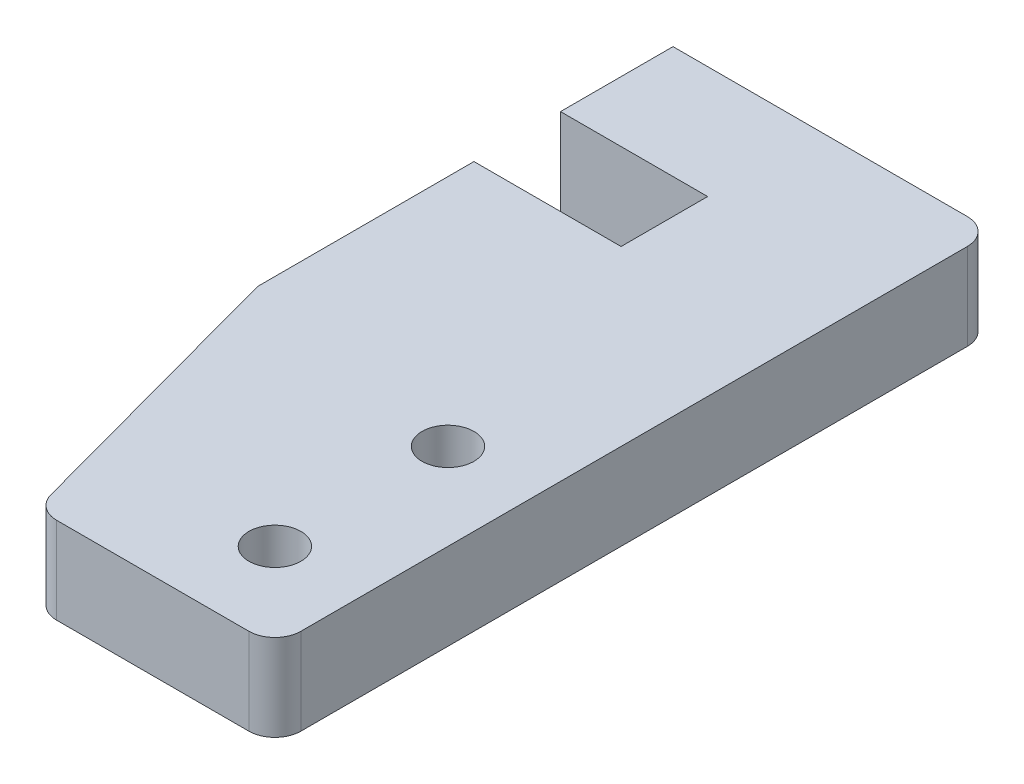
ISO-10303-21;
HEADER;
FILE_DESCRIPTION(('STEP AP214'),'2;1');
FILE_NAME('part.step','',(''),(''),'','','');
FILE_SCHEMA(('AUTOMOTIVE_DESIGN { 1 0 10303 214 1 1 1 1 }'));
ENDSEC;
DATA;
#1=APPLICATION_CONTEXT('core data for automotive mechanical design processes');
#2=APPLICATION_PROTOCOL_DEFINITION('international standard','automotive_design',2000,#1);
#3=PRODUCT_CONTEXT('',#1,'mechanical');
#4=PRODUCT('Part','Part','',(#3));
#5=PRODUCT_RELATED_PRODUCT_CATEGORY('part','',(#4));
#6=PRODUCT_DEFINITION_FORMATION('','',#4);
#7=PRODUCT_DEFINITION_CONTEXT('part definition',#1,'design');
#8=PRODUCT_DEFINITION('design','',#6,#7);
#9=PRODUCT_DEFINITION_SHAPE('','',#8);
#10=(LENGTH_UNIT() NAMED_UNIT(*) SI_UNIT(.MILLI.,.METRE.));
#11=(NAMED_UNIT(*) PLANE_ANGLE_UNIT() SI_UNIT($,.RADIAN.));
#12=(NAMED_UNIT(*) SI_UNIT($,.STERADIAN.) SOLID_ANGLE_UNIT());
#13=UNCERTAINTY_MEASURE_WITH_UNIT(LENGTH_MEASURE(1.E-05),#10,'distance_accuracy_value','');
#14=(GEOMETRIC_REPRESENTATION_CONTEXT(3) GLOBAL_UNCERTAINTY_ASSIGNED_CONTEXT((#13)) GLOBAL_UNIT_ASSIGNED_CONTEXT((#10,
#11,#12)) REPRESENTATION_CONTEXT('',''));
#15=CARTESIAN_POINT('',(0.,0.,0.));
#16=DIRECTION('',(0.,0.,1.));
#17=DIRECTION('',(1.,0.,0.));
#18=AXIS2_PLACEMENT_3D('',#15,#16,#17);
#19=CARTESIAN_POINT('',(0.,5.,0.));
#20=DIRECTION('',(0.,1.,0.));
#21=DIRECTION('',(0.,0.,1.));
#22=AXIS2_PLACEMENT_3D('',#19,#20,#21);
#23=PLANE('',#22);
#24=CARTESIAN_POINT('',(5.,5.,5.));
#25=DIRECTION('',(0.,-1.,0.));
#26=DIRECTION('',(0.,0.,-1.));
#27=AXIS2_PLACEMENT_3D('',#24,#25,#26);
#28=CIRCLE('',#27,1.5);
#29=CARTESIAN_POINT('',(5.,5.,3.5));
#30=VERTEX_POINT('',#29);
#31=EDGE_CURVE('E128',#30,#30,#28,.T.);
#32=ORIENTED_EDGE('',*,*,#31,.T.);
#33=EDGE_LOOP('',(#32));
#34=FACE_BOUND('',#33,.T.);
#35=DIRECTION('',(-1.,0.,0.));
#36=VECTOR('',#35,1.);
#37=CARTESIAN_POINT('',(10.,5.,10.));
#38=LINE('',#37,#36);
#39=CARTESIAN_POINT('',(-2.60286961664669,5.,10.));
#40=VERTEX_POINT('',#39);
#41=CARTESIAN_POINT('',(8.5,5.,10.));
#42=VERTEX_POINT('',#41);
#43=EDGE_CURVE('E145',#40,#42,#38,.F.);
#44=ORIENTED_EDGE('',*,*,#43,.T.);
#45=CARTESIAN_POINT('',(8.5,5.,8.5));
#46=DIRECTION('',(0.,-1.,0.));
#47=DIRECTION('',(0.,0.,-1.));
#48=AXIS2_PLACEMENT_3D('',#45,#46,#47);
#49=CIRCLE('',#48,1.5);
#50=CARTESIAN_POINT('',(10.,5.,8.5));
#51=VERTEX_POINT('',#50);
#52=EDGE_CURVE('E147',#51,#42,#49,.T.);
#53=ORIENTED_EDGE('',*,*,#52,.F.);
#54=DIRECTION('',(0.,0.,1.));
#55=VECTOR('',#54,1.);
#56=CARTESIAN_POINT('',(10.,5.,-25.));
#57=LINE('',#56,#55);
#58=CARTESIAN_POINT('',(10.,5.,-30.));
#59=VERTEX_POINT('',#58);
#60=EDGE_CURVE('E142',#51,#59,#57,.F.);
#61=ORIENTED_EDGE('',*,*,#60,.T.);
#62=CARTESIAN_POINT('',(8.5,5.,-30.));
#63=DIRECTION('',(0.,-1.,0.));
#64=DIRECTION('',(0.,0.,-1.));
#65=AXIS2_PLACEMENT_3D('',#62,#63,#64);
#66=CIRCLE('',#65,1.5);
#67=CARTESIAN_POINT('',(8.5,5.,-31.5));
#68=VERTEX_POINT('',#67);
#69=EDGE_CURVE('E127',#68,#59,#66,.T.);
#70=ORIENTED_EDGE('',*,*,#69,.F.);
#71=DIRECTION('',(1.,0.,0.));
#72=VECTOR('',#71,1.);
#73=CARTESIAN_POINT('',(-8.5,5.,-31.5));
#74=LINE('',#73,#72);
#75=CARTESIAN_POINT('',(-8.5,5.,-31.5));
#76=VERTEX_POINT('',#75);
#77=EDGE_CURVE('E122',#68,#76,#74,.F.);
#78=ORIENTED_EDGE('',*,*,#77,.T.);
#79=DIRECTION('',(0.,0.,-1.));
#80=VECTOR('',#79,1.);
#81=CARTESIAN_POINT('',(-8.5,5.,-25.));
#82=LINE('',#81,#80);
#83=CARTESIAN_POINT('',(-8.5,5.,-25.));
#84=VERTEX_POINT('',#83);
#85=EDGE_CURVE('E112',#76,#84,#82,.F.);
#86=ORIENTED_EDGE('',*,*,#85,.T.);
#87=DIRECTION('',(-1.,0.,0.));
#88=VECTOR('',#87,1.);
#89=CARTESIAN_POINT('',(0.,5.,-25.));
#90=LINE('',#89,#88);
#91=CARTESIAN_POINT('',(0.,5.,-25.));
#92=VERTEX_POINT('',#91);
#93=EDGE_CURVE('E168',#84,#92,#90,.F.);
#94=ORIENTED_EDGE('',*,*,#93,.T.);
#95=DIRECTION('',(0.,0.,-1.));
#96=VECTOR('',#95,1.);
#97=CARTESIAN_POINT('',(0.,5.,-20.));
#98=LINE('',#97,#96);
#99=CARTESIAN_POINT('',(0.,5.,-20.));
#100=VERTEX_POINT('',#99);
#101=EDGE_CURVE('E163',#92,#100,#98,.F.);
#102=ORIENTED_EDGE('',*,*,#101,.T.);
#103=DIRECTION('',(1.,0.,0.));
#104=VECTOR('',#103,1.);
#105=CARTESIAN_POINT('',(0.,5.,-20.));
#106=LINE('',#105,#104);
#107=CARTESIAN_POINT('',(-8.5,5.,-20.));
#108=VERTEX_POINT('',#107);
#109=EDGE_CURVE('E158',#100,#108,#106,.F.);
#110=ORIENTED_EDGE('',*,*,#109,.T.);
#111=DIRECTION('',(0.,0.,-1.));
#112=VECTOR('',#111,1.);
#113=CARTESIAN_POINT('',(-8.5,5.,-7.5));
#114=LINE('',#113,#112);
#115=CARTESIAN_POINT('',(-8.5,5.,-7.5));
#116=VERTEX_POINT('',#115);
#117=EDGE_CURVE('E82',#108,#116,#114,.F.);
#118=ORIENTED_EDGE('',*,*,#117,.T.);
#119=DIRECTION('',(-0.261950631674574,0.,-0.965081274590535));
#120=VECTOR('',#119,1.);
#121=CARTESIAN_POINT('',(-3.75,5.,10.));
#122=LINE('',#121,#120);
#123=CARTESIAN_POINT('',(-4.0504915285325,5.,8.89292594751186));
#124=VERTEX_POINT('',#123);
#125=EDGE_CURVE('E149',#116,#124,#122,.F.);
#126=ORIENTED_EDGE('',*,*,#125,.T.);
#127=CARTESIAN_POINT('',(-2.60286961664669,5.,8.5));
#128=DIRECTION('',(0.,-1.,0.));
#129=DIRECTION('',(0.,0.,-1.));
#130=AXIS2_PLACEMENT_3D('',#127,#128,#129);
#131=CIRCLE('',#130,1.5);
#132=EDGE_CURVE('E72',#40,#124,#131,.T.);
#133=ORIENTED_EDGE('',*,*,#132,.F.);
#134=EDGE_LOOP('',(#44,#53,#61,#70,#78,#86,#94,#102,#110,#118,#126,#133));
#135=FACE_BOUND('',#134,.T.);
#136=CARTESIAN_POINT('',(5.,5.,-5.));
#137=DIRECTION('',(0.,-1.,0.));
#138=DIRECTION('',(0.,0.,-1.));
#139=AXIS2_PLACEMENT_3D('',#136,#137,#138);
#140=CIRCLE('',#139,1.5);
#141=CARTESIAN_POINT('',(5.,5.,-6.5));
#142=VERTEX_POINT('',#141);
#143=EDGE_CURVE('E19',#142,#142,#140,.T.);
#144=ORIENTED_EDGE('',*,*,#143,.T.);
#145=EDGE_LOOP('',(#144));
#146=FACE_BOUND('',#145,.T.);
#147=ADVANCED_FACE('F16',(#34,#135,#146),#23,.T.);
#148=CARTESIAN_POINT('',(5.,5.,-5.));
#149=DIRECTION('',(0.,-1.,0.));
#150=DIRECTION('',(0.,0.,-1.));
#151=AXIS2_PLACEMENT_3D('',#148,#149,#150);
#152=CYLINDRICAL_SURFACE('',#151,1.5);
#153=CARTESIAN_POINT('',(5.,0.,-5.));
#154=DIRECTION('',(0.,-1.,0.));
#155=DIRECTION('',(0.,0.,-1.));
#156=AXIS2_PLACEMENT_3D('',#153,#154,#155);
#157=CIRCLE('',#156,1.5);
#158=CARTESIAN_POINT('',(5.,0.,-6.5));
#159=VERTEX_POINT('',#158);
#160=EDGE_CURVE('E131',#159,#159,#157,.T.);
#161=ORIENTED_EDGE('',*,*,#160,.T.);
#162=EDGE_LOOP('',(#161));
#163=FACE_BOUND('',#162,.T.);
#164=ORIENTED_EDGE('',*,*,#143,.F.);
#165=EDGE_LOOP('',(#164));
#166=FACE_BOUND('',#165,.T.);
#167=ADVANCED_FACE('F404',(#163,#166),#152,.F.);
#168=CARTESIAN_POINT('',(-8.5,5.,-25.));
#169=DIRECTION('',(1.,0.,0.));
#170=DIRECTION('',(0.,0.,-1.));
#171=AXIS2_PLACEMENT_3D('',#168,#169,#170);
#172=PLANE('',#171);
#173=DIRECTION('',(0.,1.,0.));
#174=VECTOR('',#173,1.);
#175=CARTESIAN_POINT('',(-8.5,5.,-25.));
#176=LINE('',#175,#174);
#177=CARTESIAN_POINT('',(-8.5,0.,-25.));
#178=VERTEX_POINT('',#177);
#179=EDGE_CURVE('E117',#178,#84,#176,.T.);
#180=ORIENTED_EDGE('',*,*,#179,.T.);
#181=ORIENTED_EDGE('',*,*,#85,.F.);
#182=DIRECTION('',(0.,1.,0.));
#183=VECTOR('',#182,1.);
#184=CARTESIAN_POINT('',(-8.5,5.,-31.5));
#185=LINE('',#184,#183);
#186=CARTESIAN_POINT('',(-8.5,0.,-31.5));
#187=VERTEX_POINT('',#186);
#188=EDGE_CURVE('E116',#76,#187,#185,.F.);
#189=ORIENTED_EDGE('',*,*,#188,.T.);
#190=DIRECTION('',(0.,0.,1.));
#191=VECTOR('',#190,1.);
#192=CARTESIAN_POINT('',(-8.5,0.,0.));
#193=LINE('',#192,#191);
#194=EDGE_CURVE('E185',#187,#178,#193,.T.);
#195=ORIENTED_EDGE('',*,*,#194,.T.);
#196=EDGE_LOOP('',(#180,#181,#189,#195));
#197=FACE_BOUND('',#196,.T.);
#198=ADVANCED_FACE('F114',(#197),#172,.F.);
#199=CARTESIAN_POINT('',(0.,5.,-25.));
#200=DIRECTION('',(0.,0.,-1.));
#201=DIRECTION('',(-1.,0.,0.));
#202=AXIS2_PLACEMENT_3D('',#199,#200,#201);
#203=PLANE('',#202);
#204=DIRECTION('',(0.,1.,0.));
#205=VECTOR('',#204,1.);
#206=CARTESIAN_POINT('',(0.,5.,-25.));
#207=LINE('',#206,#205);
#208=CARTESIAN_POINT('',(0.,0.,-25.));
#209=VERTEX_POINT('',#208);
#210=EDGE_CURVE('E165',#209,#92,#207,.T.);
#211=ORIENTED_EDGE('',*,*,#210,.T.);
#212=ORIENTED_EDGE('',*,*,#93,.F.);
#213=ORIENTED_EDGE('',*,*,#179,.F.);
#214=DIRECTION('',(1.,0.,0.));
#215=VECTOR('',#214,1.);
#216=CARTESIAN_POINT('',(0.,0.,-25.));
#217=LINE('',#216,#215);
#218=EDGE_CURVE('E221',#178,#209,#217,.T.);
#219=ORIENTED_EDGE('',*,*,#218,.T.);
#220=EDGE_LOOP('',(#211,#212,#213,#219));
#221=FACE_BOUND('',#220,.T.);
#222=ADVANCED_FACE('F278',(#221),#203,.F.);
#223=CARTESIAN_POINT('',(0.,5.,-20.));
#224=DIRECTION('',(1.,0.,0.));
#225=DIRECTION('',(0.,0.,-1.));
#226=AXIS2_PLACEMENT_3D('',#223,#224,#225);
#227=PLANE('',#226);
#228=DIRECTION('',(0.,1.,0.));
#229=VECTOR('',#228,1.);
#230=CARTESIAN_POINT('',(0.,5.,-20.));
#231=LINE('',#230,#229);
#232=CARTESIAN_POINT('',(0.,0.,-20.));
#233=VERTEX_POINT('',#232);
#234=EDGE_CURVE('E160',#233,#100,#231,.T.);
#235=ORIENTED_EDGE('',*,*,#234,.T.);
#236=ORIENTED_EDGE('',*,*,#101,.F.);
#237=ORIENTED_EDGE('',*,*,#210,.F.);
#238=DIRECTION('',(0.,0.,1.));
#239=VECTOR('',#238,1.);
#240=CARTESIAN_POINT('',(0.,0.,0.));
#241=LINE('',#240,#239);
#242=EDGE_CURVE('E212',#209,#233,#241,.T.);
#243=ORIENTED_EDGE('',*,*,#242,.T.);
#244=EDGE_LOOP('',(#235,#236,#237,#243));
#245=FACE_BOUND('',#244,.T.);
#246=ADVANCED_FACE('F276',(#245),#227,.F.);
#247=CARTESIAN_POINT('',(0.,5.,-20.));
#248=DIRECTION('',(0.,0.,1.));
#249=DIRECTION('',(1.,0.,0.));
#250=AXIS2_PLACEMENT_3D('',#247,#248,#249);
#251=PLANE('',#250);
#252=DIRECTION('',(0.,1.,0.));
#253=VECTOR('',#252,1.);
#254=CARTESIAN_POINT('',(-8.5,5.,-20.));
#255=LINE('',#254,#253);
#256=CARTESIAN_POINT('',(-8.5,0.,-20.));
#257=VERTEX_POINT('',#256);
#258=EDGE_CURVE('E155',#257,#108,#255,.T.);
#259=ORIENTED_EDGE('',*,*,#258,.T.);
#260=ORIENTED_EDGE('',*,*,#109,.F.);
#261=ORIENTED_EDGE('',*,*,#234,.F.);
#262=DIRECTION('',(1.,0.,0.));
#263=VECTOR('',#262,1.);
#264=CARTESIAN_POINT('',(0.,0.,-20.));
#265=LINE('',#264,#263);
#266=EDGE_CURVE('E203',#233,#257,#265,.F.);
#267=ORIENTED_EDGE('',*,*,#266,.T.);
#268=EDGE_LOOP('',(#259,#260,#261,#267));
#269=FACE_BOUND('',#268,.T.);
#270=ADVANCED_FACE('F273',(#269),#251,.F.);
#271=CARTESIAN_POINT('',(-8.5,5.,-7.5));
#272=DIRECTION('',(1.,0.,0.));
#273=DIRECTION('',(0.,0.,-1.));
#274=AXIS2_PLACEMENT_3D('',#271,#272,#273);
#275=PLANE('',#274);
#276=DIRECTION('',(0.,1.,0.));
#277=VECTOR('',#276,1.);
#278=CARTESIAN_POINT('',(-8.5,5.,-7.5));
#279=LINE('',#278,#277);
#280=CARTESIAN_POINT('',(-8.5,0.,-7.5));
#281=VERTEX_POINT('',#280);
#282=EDGE_CURVE('E151',#281,#116,#279,.T.);
#283=ORIENTED_EDGE('',*,*,#282,.T.);
#284=ORIENTED_EDGE('',*,*,#117,.F.);
#285=ORIENTED_EDGE('',*,*,#258,.F.);
#286=DIRECTION('',(0.,0.,1.));
#287=VECTOR('',#286,1.);
#288=CARTESIAN_POINT('',(-8.5,0.,0.));
#289=LINE('',#288,#287);
#290=EDGE_CURVE('E200',#257,#281,#289,.T.);
#291=ORIENTED_EDGE('',*,*,#290,.T.);
#292=EDGE_LOOP('',(#283,#284,#285,#291));
#293=FACE_BOUND('',#292,.T.);
#294=ADVANCED_FACE('F270',(#293),#275,.F.);
#295=CARTESIAN_POINT('',(-3.75,5.,10.));
#296=DIRECTION('',(0.965081274590535,0.,-0.261950631674574));
#297=DIRECTION('',(-0.261950631674574,0.,-0.965081274590535));
#298=AXIS2_PLACEMENT_3D('',#295,#296,#297);
#299=PLANE('',#298);
#300=DIRECTION('',(0.,-1.,0.));
#301=VECTOR('',#300,1.);
#302=CARTESIAN_POINT('',(-4.0504915285325,5.,8.89292594751186));
#303=LINE('',#302,#301);
#304=CARTESIAN_POINT('',(-4.0504915285325,0.,8.89292594751186));
#305=VERTEX_POINT('',#304);
#306=EDGE_CURVE('E189',#124,#305,#303,.T.);
#307=ORIENTED_EDGE('',*,*,#306,.F.);
#308=ORIENTED_EDGE('',*,*,#125,.F.);
#309=ORIENTED_EDGE('',*,*,#282,.F.);
#310=DIRECTION('',(0.261950631674574,0.,0.965081274590535));
#311=VECTOR('',#310,1.);
#312=CARTESIAN_POINT('',(-8.5,0.,-7.5));
#313=LINE('',#312,#311);
#314=EDGE_CURVE('E183',#281,#305,#313,.T.);
#315=ORIENTED_EDGE('',*,*,#314,.T.);
#316=EDGE_LOOP('',(#307,#308,#309,#315));
#317=FACE_BOUND('',#316,.T.);
#318=ADVANCED_FACE('F266',(#317),#299,.F.);
#319=CARTESIAN_POINT('',(-2.60286961664669,5.,8.5));
#320=DIRECTION('',(0.,-1.,0.));
#321=DIRECTION('',(0.,0.,-1.));
#322=AXIS2_PLACEMENT_3D('',#319,#320,#321);
#323=CYLINDRICAL_SURFACE('',#322,1.5);
#324=CARTESIAN_POINT('',(-2.60286961664669,0.,8.5));
#325=DIRECTION('',(0.,-1.,0.));
#326=DIRECTION('',(0.,0.,-1.));
#327=AXIS2_PLACEMENT_3D('',#324,#325,#326);
#328=CIRCLE('',#327,1.5);
#329=CARTESIAN_POINT('',(-2.60286961664669,0.,10.));
#330=VERTEX_POINT('',#329);
#331=EDGE_CURVE('E180',#305,#330,#328,.F.);
#332=ORIENTED_EDGE('',*,*,#331,.T.);
#333=DIRECTION('',(0.,1.,0.));
#334=VECTOR('',#333,1.);
#335=CARTESIAN_POINT('',(-2.60286961664669,5.,10.));
#336=LINE('',#335,#334);
#337=EDGE_CURVE('E148',#330,#40,#336,.T.);
#338=ORIENTED_EDGE('',*,*,#337,.T.);
#339=ORIENTED_EDGE('',*,*,#132,.T.);
#340=ORIENTED_EDGE('',*,*,#306,.T.);
#341=EDGE_LOOP('',(#332,#338,#339,#340));
#342=FACE_BOUND('',#341,.T.);
#343=ADVANCED_FACE('F286',(#342),#323,.T.);
#344=CARTESIAN_POINT('',(10.,5.,10.));
#345=DIRECTION('',(0.,0.,-1.));
#346=DIRECTION('',(-1.,0.,0.));
#347=AXIS2_PLACEMENT_3D('',#344,#345,#346);
#348=PLANE('',#347);
#349=DIRECTION('',(0.,-1.,0.));
#350=VECTOR('',#349,1.);
#351=CARTESIAN_POINT('',(8.5,5.,10.));
#352=LINE('',#351,#350);
#353=CARTESIAN_POINT('',(8.5,0.,10.));
#354=VERTEX_POINT('',#353);
#355=EDGE_CURVE('E188',#42,#354,#352,.T.);
#356=ORIENTED_EDGE('',*,*,#355,.F.);
#357=ORIENTED_EDGE('',*,*,#43,.F.);
#358=ORIENTED_EDGE('',*,*,#337,.F.);
#359=DIRECTION('',(1.,0.,0.));
#360=VECTOR('',#359,1.);
#361=CARTESIAN_POINT('',(0.,0.,10.));
#362=LINE('',#361,#360);
#363=EDGE_CURVE('E179',#330,#354,#362,.T.);
#364=ORIENTED_EDGE('',*,*,#363,.T.);
#365=EDGE_LOOP('',(#356,#357,#358,#364));
#366=FACE_BOUND('',#365,.T.);
#367=ADVANCED_FACE('F255',(#366),#348,.F.);
#368=CARTESIAN_POINT('',(8.5,5.,8.5));
#369=DIRECTION('',(0.,-1.,0.));
#370=DIRECTION('',(0.,0.,-1.));
#371=AXIS2_PLACEMENT_3D('',#368,#369,#370);
#372=CYLINDRICAL_SURFACE('',#371,1.5);
#373=CARTESIAN_POINT('',(8.5,0.,8.5));
#374=DIRECTION('',(0.,-1.,0.));
#375=DIRECTION('',(0.,0.,-1.));
#376=AXIS2_PLACEMENT_3D('',#373,#374,#375);
#377=CIRCLE('',#376,1.5);
#378=CARTESIAN_POINT('',(10.,0.,8.5));
#379=VERTEX_POINT('',#378);
#380=EDGE_CURVE('E176',#354,#379,#377,.F.);
#381=ORIENTED_EDGE('',*,*,#380,.T.);
#382=DIRECTION('',(0.,1.,0.));
#383=VECTOR('',#382,1.);
#384=CARTESIAN_POINT('',(10.,5.,8.5));
#385=LINE('',#384,#383);
#386=EDGE_CURVE('E144',#379,#51,#385,.T.);
#387=ORIENTED_EDGE('',*,*,#386,.T.);
#388=ORIENTED_EDGE('',*,*,#52,.T.);
#389=ORIENTED_EDGE('',*,*,#355,.T.);
#390=EDGE_LOOP('',(#381,#387,#388,#389));
#391=FACE_BOUND('',#390,.T.);
#392=ADVANCED_FACE('F245',(#391),#372,.T.);
#393=CARTESIAN_POINT('',(10.,5.,-25.));
#394=DIRECTION('',(-1.,0.,0.));
#395=DIRECTION('',(0.,0.,1.));
#396=AXIS2_PLACEMENT_3D('',#393,#394,#395);
#397=PLANE('',#396);
#398=DIRECTION('',(0.,-1.,0.));
#399=VECTOR('',#398,1.);
#400=CARTESIAN_POINT('',(10.,5.,-30.));
#401=LINE('',#400,#399);
#402=CARTESIAN_POINT('',(10.,0.,-30.));
#403=VERTEX_POINT('',#402);
#404=EDGE_CURVE('E123',#59,#403,#401,.T.);
#405=ORIENTED_EDGE('',*,*,#404,.F.);
#406=ORIENTED_EDGE('',*,*,#60,.F.);
#407=ORIENTED_EDGE('',*,*,#386,.F.);
#408=DIRECTION('',(0.,0.,1.));
#409=VECTOR('',#408,1.);
#410=CARTESIAN_POINT('',(10.,0.,0.));
#411=LINE('',#410,#409);
#412=EDGE_CURVE('E175',#379,#403,#411,.F.);
#413=ORIENTED_EDGE('',*,*,#412,.T.);
#414=EDGE_LOOP('',(#405,#406,#407,#413));
#415=FACE_BOUND('',#414,.T.);
#416=ADVANCED_FACE('F285',(#415),#397,.F.);
#417=CARTESIAN_POINT('',(8.5,5.,-30.));
#418=DIRECTION('',(0.,-1.,0.));
#419=DIRECTION('',(0.,0.,-1.));
#420=AXIS2_PLACEMENT_3D('',#417,#418,#419);
#421=CYLINDRICAL_SURFACE('',#420,1.5);
#422=CARTESIAN_POINT('',(8.5,0.,-30.));
#423=DIRECTION('',(0.,-1.,0.));
#424=DIRECTION('',(0.,0.,-1.));
#425=AXIS2_PLACEMENT_3D('',#422,#423,#424);
#426=CIRCLE('',#425,1.5);
#427=CARTESIAN_POINT('',(8.5,0.,-31.5));
#428=VERTEX_POINT('',#427);
#429=EDGE_CURVE('E172',#403,#428,#426,.F.);
#430=ORIENTED_EDGE('',*,*,#429,.T.);
#431=DIRECTION('',(0.,1.,0.));
#432=VECTOR('',#431,1.);
#433=CARTESIAN_POINT('',(8.5,5.,-31.5));
#434=LINE('',#433,#432);
#435=EDGE_CURVE('E34',#428,#68,#434,.T.);
#436=ORIENTED_EDGE('',*,*,#435,.T.);
#437=ORIENTED_EDGE('',*,*,#69,.T.);
#438=ORIENTED_EDGE('',*,*,#404,.T.);
#439=EDGE_LOOP('',(#430,#436,#437,#438));
#440=FACE_BOUND('',#439,.T.);
#441=ADVANCED_FACE('F281',(#440),#421,.T.);
#442=CARTESIAN_POINT('',(-8.5,5.,-31.5));
#443=DIRECTION('',(0.,0.,1.));
#444=DIRECTION('',(1.,0.,0.));
#445=AXIS2_PLACEMENT_3D('',#442,#443,#444);
#446=PLANE('',#445);
#447=ORIENTED_EDGE('',*,*,#435,.F.);
#448=DIRECTION('',(1.,0.,0.));
#449=VECTOR('',#448,1.);
#450=CARTESIAN_POINT('',(0.,0.,-31.5));
#451=LINE('',#450,#449);
#452=EDGE_CURVE('E25',#428,#187,#451,.F.);
#453=ORIENTED_EDGE('',*,*,#452,.T.);
#454=ORIENTED_EDGE('',*,*,#188,.F.);
#455=ORIENTED_EDGE('',*,*,#77,.F.);
#456=EDGE_LOOP('',(#447,#453,#454,#455));
#457=FACE_BOUND('',#456,.T.);
#458=ADVANCED_FACE('F121',(#457),#446,.F.);
#459=CARTESIAN_POINT('',(5.,5.,5.));
#460=DIRECTION('',(0.,-1.,0.));
#461=DIRECTION('',(0.,0.,-1.));
#462=AXIS2_PLACEMENT_3D('',#459,#460,#461);
#463=CYLINDRICAL_SURFACE('',#462,1.5);
#464=CARTESIAN_POINT('',(5.,0.,5.));
#465=DIRECTION('',(0.,-1.,0.));
#466=DIRECTION('',(0.,0.,-1.));
#467=AXIS2_PLACEMENT_3D('',#464,#465,#466);
#468=CIRCLE('',#467,1.5);
#469=CARTESIAN_POINT('',(5.,0.,3.5));
#470=VERTEX_POINT('',#469);
#471=EDGE_CURVE('E11',#470,#470,#468,.T.);
#472=ORIENTED_EDGE('',*,*,#471,.T.);
#473=EDGE_LOOP('',(#472));
#474=FACE_BOUND('',#473,.T.);
#475=ORIENTED_EDGE('',*,*,#31,.F.);
#476=EDGE_LOOP('',(#475));
#477=FACE_BOUND('',#476,.T.);
#478=ADVANCED_FACE('F297',(#474,#477),#463,.F.);
#479=CARTESIAN_POINT('',(0.,0.,0.));
#480=DIRECTION('',(0.,1.,0.));
#481=DIRECTION('',(0.,0.,1.));
#482=AXIS2_PLACEMENT_3D('',#479,#480,#481);
#483=PLANE('',#482);
#484=ORIENTED_EDGE('',*,*,#471,.F.);
#485=EDGE_LOOP('',(#484));
#486=FACE_BOUND('',#485,.T.);
#487=ORIENTED_EDGE('',*,*,#429,.F.);
#488=ORIENTED_EDGE('',*,*,#412,.F.);
#489=ORIENTED_EDGE('',*,*,#380,.F.);
#490=ORIENTED_EDGE('',*,*,#363,.F.);
#491=ORIENTED_EDGE('',*,*,#331,.F.);
#492=ORIENTED_EDGE('',*,*,#314,.F.);
#493=ORIENTED_EDGE('',*,*,#290,.F.);
#494=ORIENTED_EDGE('',*,*,#266,.F.);
#495=ORIENTED_EDGE('',*,*,#242,.F.);
#496=ORIENTED_EDGE('',*,*,#218,.F.);
#497=ORIENTED_EDGE('',*,*,#194,.F.);
#498=ORIENTED_EDGE('',*,*,#452,.F.);
#499=EDGE_LOOP('',(#487,#488,#489,#490,#491,#492,#493,#494,#495,#496,#497,#498));
#500=FACE_BOUND('',#499,.T.);
#501=ORIENTED_EDGE('',*,*,#160,.F.);
#502=EDGE_LOOP('',(#501));
#503=FACE_BOUND('',#502,.T.);
#504=ADVANCED_FACE('F252',(#486,#500,#503),#483,.F.);
#505=CLOSED_SHELL('',(#147,#167,#198,#222,#246,#270,#294,#318,#343,#367,#392,#416,#441,#458,
#478,#504));
#506=MANIFOLD_SOLID_BREP('B1',#505);
#507=ADVANCED_BREP_SHAPE_REPRESENTATION('',(#18,#506),#14);
#508=SHAPE_DEFINITION_REPRESENTATION(#9,#507);
ENDSEC;
END-ISO-10303-21;
